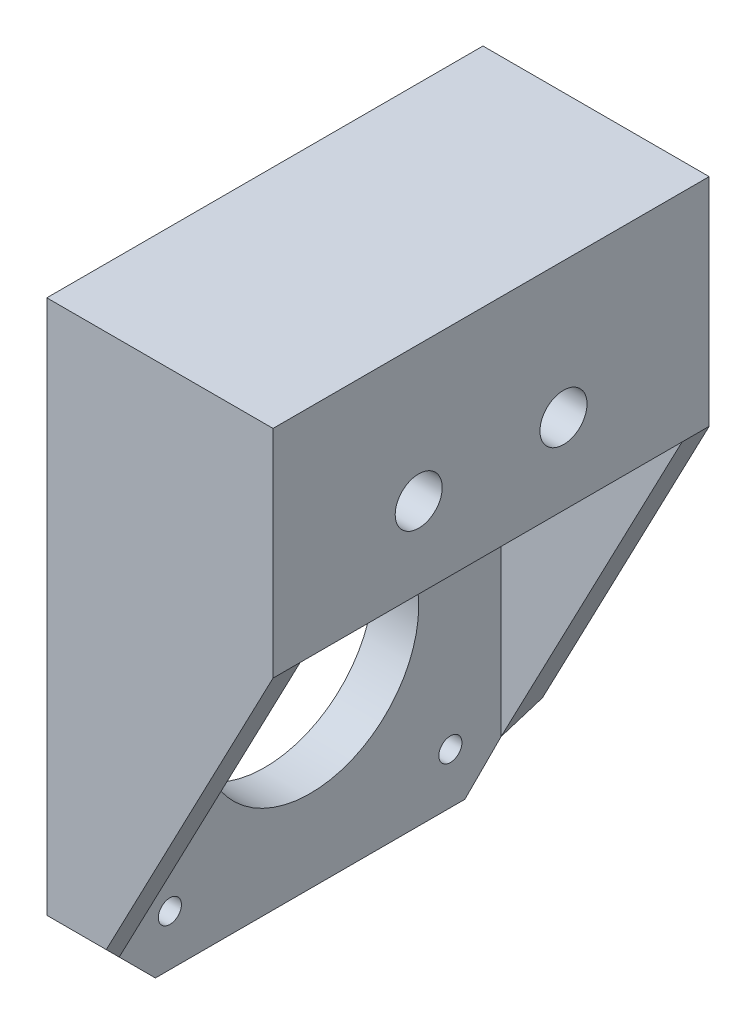
ISO-10303-21;
HEADER;
FILE_DESCRIPTION(('STEP AP214'),'2;1');
FILE_NAME('part.step','',(''),(''),'','','');
FILE_SCHEMA(('AUTOMOTIVE_DESIGN { 1 0 10303 214 1 1 1 1 }'));
ENDSEC;
DATA;
#1=APPLICATION_CONTEXT('core data for automotive mechanical design processes');
#2=APPLICATION_PROTOCOL_DEFINITION('international standard','automotive_design',2000,#1);
#3=PRODUCT_CONTEXT('',#1,'mechanical');
#4=PRODUCT('Part','Part','',(#3));
#5=PRODUCT_RELATED_PRODUCT_CATEGORY('part','',(#4));
#6=PRODUCT_DEFINITION_FORMATION('','',#4);
#7=PRODUCT_DEFINITION_CONTEXT('part definition',#1,'design');
#8=PRODUCT_DEFINITION('design','',#6,#7);
#9=PRODUCT_DEFINITION_SHAPE('','',#8);
#10=(LENGTH_UNIT() NAMED_UNIT(*) SI_UNIT(.MILLI.,.METRE.));
#11=(NAMED_UNIT(*) PLANE_ANGLE_UNIT() SI_UNIT($,.RADIAN.));
#12=(NAMED_UNIT(*) SI_UNIT($,.STERADIAN.) SOLID_ANGLE_UNIT());
#13=UNCERTAINTY_MEASURE_WITH_UNIT(LENGTH_MEASURE(1.E-05),#10,'distance_accuracy_value','');
#14=(GEOMETRIC_REPRESENTATION_CONTEXT(3) GLOBAL_UNCERTAINTY_ASSIGNED_CONTEXT((#13)) GLOBAL_UNIT_ASSIGNED_CONTEXT((#10,
#11,#12)) REPRESENTATION_CONTEXT('',''));
#15=CARTESIAN_POINT('',(0.,0.,0.));
#16=DIRECTION('',(0.,0.,1.));
#17=DIRECTION('',(1.,0.,0.));
#18=AXIS2_PLACEMENT_3D('',#15,#16,#17);
#19=CARTESIAN_POINT('',(20.,0.,0.));
#20=DIRECTION('',(1.,0.,0.));
#21=DIRECTION('',(0.,0.,-1.));
#22=AXIS2_PLACEMENT_3D('',#19,#20,#21);
#23=PLANE('',#22);
#24=CARTESIAN_POINT('',(20.,16.9214351595647,13.4826477279715));
#25=DIRECTION('',(-1.,0.,0.));
#26=DIRECTION('',(0.,0.,1.));
#27=AXIS2_PLACEMENT_3D('',#24,#25,#26);
#28=CIRCLE('',#27,2.59999999999999);
#29=CARTESIAN_POINT('',(20.,16.9214351595647,16.0826477279715));
#30=VERTEX_POINT('',#29);
#31=EDGE_CURVE('E511',#30,#30,#28,.F.);
#32=ORIENTED_EDGE('',*,*,#31,.T.);
#33=EDGE_LOOP('',(#32));
#34=FACE_BOUND('',#33,.T.);
#35=CARTESIAN_POINT('',(20.,16.9214351595647,29.4826477279715));
#36=DIRECTION('',(-1.,0.,0.));
#37=DIRECTION('',(0.,0.,1.));
#38=AXIS2_PLACEMENT_3D('',#35,#36,#37);
#39=CIRCLE('',#38,2.59999999999999);
#40=CARTESIAN_POINT('',(20.,16.9214351595647,32.0826477279715));
#41=VERTEX_POINT('',#40);
#42=EDGE_CURVE('E510',#41,#41,#39,.T.);
#43=ORIENTED_EDGE('',*,*,#42,.F.);
#44=EDGE_LOOP('',(#43));
#45=FACE_BOUND('',#44,.T.);
#46=DIRECTION('',(0.,0.,1.));
#47=VECTOR('',#46,1.);
#48=CARTESIAN_POINT('',(20.,26.9214351595647,0.));
#49=LINE('',#48,#47);
#50=CARTESIAN_POINT('',(20.,26.9214351595647,9.48264772797149));
#51=VERTEX_POINT('',#50);
#52=CARTESIAN_POINT('',(20.,26.9214351595647,33.4826477279715));
#53=VERTEX_POINT('',#52);
#54=EDGE_CURVE('E204',#51,#53,#49,.T.);
#55=ORIENTED_EDGE('',*,*,#54,.F.);
#56=DIRECTION('',(0.,-1.,0.));
#57=VECTOR('',#56,1.);
#58=CARTESIAN_POINT('',(20.,8.02143515956464,9.48264772797147));
#59=LINE('',#58,#57);
#60=CARTESIAN_POINT('',(20.,8.02143515956464,9.48264772797149));
#61=VERTEX_POINT('',#60);
#62=EDGE_CURVE('E231',#51,#61,#59,.T.);
#63=ORIENTED_EDGE('',*,*,#62,.T.);
#64=DIRECTION('',(0.,0.,-1.));
#65=VECTOR('',#64,1.);
#66=CARTESIAN_POINT('',(20.,8.02143515956464,45.5826477279715));
#67=LINE('',#66,#65);
#68=CARTESIAN_POINT('',(20.,8.02143515956464,33.4826477279715));
#69=VERTEX_POINT('',#68);
#70=EDGE_CURVE('E375',#69,#61,#67,.T.);
#71=ORIENTED_EDGE('',*,*,#70,.F.);
#72=DIRECTION('',(0.,1.,0.));
#73=VECTOR('',#72,1.);
#74=CARTESIAN_POINT('',(20.,25.8214351595647,33.4826477279715));
#75=LINE('',#74,#73);
#76=EDGE_CURVE('E235',#69,#53,#75,.T.);
#77=ORIENTED_EDGE('',*,*,#76,.T.);
#78=EDGE_LOOP('',(#55,#63,#71,#77));
#79=FACE_BOUND('',#78,.T.);
#80=ADVANCED_FACE('F47',(#34,#45,#79),#23,.F.);
#81=CARTESIAN_POINT('',(5.,0.,6.48264772797147));
#82=DIRECTION('',(0.,0.,-1.));
#83=DIRECTION('',(-1.,0.,0.));
#84=AXIS2_PLACEMENT_3D('',#81,#82,#83);
#85=PLANE('',#84);
#86=DIRECTION('',(1.,0.,0.));
#87=VECTOR('',#86,1.);
#88=CARTESIAN_POINT('',(5.,26.9214351595647,6.48264772797147));
#89=LINE('',#88,#87);
#90=CARTESIAN_POINT('',(0.,26.9214351595647,6.48264772797147));
#91=VERTEX_POINT('',#90);
#92=CARTESIAN_POINT('',(17.,26.9214351595647,6.48264772797147));
#93=VERTEX_POINT('',#92);
#94=EDGE_CURVE('E186',#91,#93,#89,.T.);
#95=ORIENTED_EDGE('',*,*,#94,.F.);
#96=DIRECTION('',(0.,-1.,0.));
#97=VECTOR('',#96,1.);
#98=CARTESIAN_POINT('',(0.,0.,6.48264772797147));
#99=LINE('',#98,#97);
#100=CARTESIAN_POINT('',(0.,11.0214351595646,6.48264772797147));
#101=VERTEX_POINT('',#100);
#102=EDGE_CURVE('E198',#91,#101,#99,.T.);
#103=ORIENTED_EDGE('',*,*,#102,.T.);
#104=DIRECTION('',(-1.,0.,0.));
#105=VECTOR('',#104,1.);
#106=CARTESIAN_POINT('',(5.,11.0214351595646,6.48264772797147));
#107=LINE('',#106,#105);
#108=CARTESIAN_POINT('',(5.,11.0214351595646,6.48264772797147));
#109=VERTEX_POINT('',#108);
#110=EDGE_CURVE('E265',#101,#109,#107,.F.);
#111=ORIENTED_EDGE('',*,*,#110,.T.);
#112=DIRECTION('',(0.,-1.,0.));
#113=VECTOR('',#112,1.);
#114=CARTESIAN_POINT('',(5.,0.,6.48264772797147));
#115=LINE('',#114,#113);
#116=CARTESIAN_POINT('',(5.,8.02143515956464,6.48264772797147));
#117=VERTEX_POINT('',#116);
#118=EDGE_CURVE('E70',#109,#117,#115,.T.);
#119=ORIENTED_EDGE('',*,*,#118,.T.);
#120=DIRECTION('',(-1.,0.,0.));
#121=VECTOR('',#120,1.);
#122=CARTESIAN_POINT('',(25.,8.02143515956464,6.48264772797147));
#123=LINE('',#122,#121);
#124=CARTESIAN_POINT('',(17.,8.02143515956464,6.48264772797147));
#125=VERTEX_POINT('',#124);
#126=EDGE_CURVE('E292',#125,#117,#123,.T.);
#127=ORIENTED_EDGE('',*,*,#126,.F.);
#128=DIRECTION('',(0.,-1.,0.));
#129=VECTOR('',#128,1.);
#130=CARTESIAN_POINT('',(17.,25.8214351595647,6.48264772797147));
#131=LINE('',#130,#129);
#132=EDGE_CURVE('E202',#125,#93,#131,.F.);
#133=ORIENTED_EDGE('',*,*,#132,.T.);
#134=EDGE_LOOP('',(#95,#103,#111,#119,#127,#133));
#135=FACE_BOUND('',#134,.T.);
#136=ADVANCED_FACE('F197',(#135),#85,.F.);
#137=CARTESIAN_POINT('',(5.,0.,36.4826477279715));
#138=DIRECTION('',(0.,0.,1.));
#139=DIRECTION('',(-1.,0.,0.));
#140=AXIS2_PLACEMENT_3D('',#137,#138,#139);
#141=PLANE('',#140);
#142=DIRECTION('',(-1.,0.,0.));
#143=VECTOR('',#142,1.);
#144=CARTESIAN_POINT('',(5.,26.9214351595647,36.4826477279715));
#145=LINE('',#144,#143);
#146=CARTESIAN_POINT('',(17.,26.9214351595647,36.4826477279715));
#147=VERTEX_POINT('',#146);
#148=CARTESIAN_POINT('',(0.,26.9214351595647,36.4826477279715));
#149=VERTEX_POINT('',#148);
#150=EDGE_CURVE('E189',#147,#149,#145,.T.);
#151=ORIENTED_EDGE('',*,*,#150,.F.);
#152=DIRECTION('',(0.,1.,0.));
#153=VECTOR('',#152,1.);
#154=CARTESIAN_POINT('',(17.,8.02143515956464,36.4826477279715));
#155=LINE('',#154,#153);
#156=CARTESIAN_POINT('',(17.,8.02143515956464,36.4826477279715));
#157=VERTEX_POINT('',#156);
#158=EDGE_CURVE('E239',#147,#157,#155,.F.);
#159=ORIENTED_EDGE('',*,*,#158,.T.);
#160=DIRECTION('',(-1.,0.,0.));
#161=VECTOR('',#160,1.);
#162=CARTESIAN_POINT('',(25.,8.02143515956464,36.4826477279715));
#163=LINE('',#162,#161);
#164=CARTESIAN_POINT('',(5.,8.02143515956464,36.4826477279715));
#165=VERTEX_POINT('',#164);
#166=EDGE_CURVE('E417',#157,#165,#163,.T.);
#167=ORIENTED_EDGE('',*,*,#166,.T.);
#168=DIRECTION('',(0.,1.,0.));
#169=VECTOR('',#168,1.);
#170=CARTESIAN_POINT('',(5.,0.,36.4826477279715));
#171=LINE('',#170,#169);
#172=CARTESIAN_POINT('',(5.,11.0214351595646,36.4826477279715));
#173=VERTEX_POINT('',#172);
#174=EDGE_CURVE('E63',#165,#173,#171,.T.);
#175=ORIENTED_EDGE('',*,*,#174,.T.);
#176=DIRECTION('',(-1.,0.,0.));
#177=VECTOR('',#176,1.);
#178=CARTESIAN_POINT('',(0.,11.0214351595646,36.4826477279715));
#179=LINE('',#178,#177);
#180=CARTESIAN_POINT('',(0.,11.0214351595646,36.4826477279715));
#181=VERTEX_POINT('',#180);
#182=EDGE_CURVE('E252',#173,#181,#179,.T.);
#183=ORIENTED_EDGE('',*,*,#182,.T.);
#184=DIRECTION('',(0.,-1.,0.));
#185=VECTOR('',#184,1.);
#186=CARTESIAN_POINT('',(0.,0.,36.4826477279715));
#187=LINE('',#186,#185);
#188=EDGE_CURVE('E428',#149,#181,#187,.T.);
#189=ORIENTED_EDGE('',*,*,#188,.F.);
#190=EDGE_LOOP('',(#151,#159,#167,#175,#183,#189));
#191=FACE_BOUND('',#190,.T.);
#192=ADVANCED_FACE('F559',(#191),#141,.F.);
#193=CARTESIAN_POINT('',(17.,0.,33.4826477279715));
#194=DIRECTION('',(0.,-1.,0.));
#195=DIRECTION('',(0.,0.,-1.));
#196=AXIS2_PLACEMENT_3D('',#193,#194,#195);
#197=CYLINDRICAL_SURFACE('',#196,3.);
#198=CARTESIAN_POINT('',(17.,26.9214351595647,33.4826477279715));
#199=DIRECTION('',(0.,1.,0.));
#200=DIRECTION('',(0.,0.,1.));
#201=AXIS2_PLACEMENT_3D('',#198,#199,#200);
#202=CIRCLE('',#201,3.);
#203=EDGE_CURVE('E497',#53,#147,#202,.F.);
#204=ORIENTED_EDGE('',*,*,#203,.F.);
#205=ORIENTED_EDGE('',*,*,#76,.F.);
#206=CARTESIAN_POINT('',(17.,8.02143515956464,33.4826477279715));
#207=DIRECTION('',(0.,-1.,0.));
#208=DIRECTION('',(0.,0.,-1.));
#209=AXIS2_PLACEMENT_3D('',#206,#207,#208);
#210=CIRCLE('',#209,3.);
#211=EDGE_CURVE('E244',#157,#69,#210,.F.);
#212=ORIENTED_EDGE('',*,*,#211,.F.);
#213=ORIENTED_EDGE('',*,*,#158,.F.);
#214=EDGE_LOOP('',(#204,#205,#212,#213));
#215=FACE_BOUND('',#214,.T.);
#216=ADVANCED_FACE('F496',(#215),#197,.F.);
#217=CARTESIAN_POINT('',(17.,0.,9.48264772797147));
#218=DIRECTION('',(0.,1.,0.));
#219=DIRECTION('',(0.,0.,1.));
#220=AXIS2_PLACEMENT_3D('',#217,#218,#219);
#221=CYLINDRICAL_SURFACE('',#220,3.);
#222=CARTESIAN_POINT('',(17.,26.9214351595647,9.48264772797147));
#223=DIRECTION('',(0.,1.,0.));
#224=DIRECTION('',(0.,0.,1.));
#225=AXIS2_PLACEMENT_3D('',#222,#223,#224);
#226=CIRCLE('',#225,3.);
#227=EDGE_CURVE('E11',#93,#51,#226,.F.);
#228=ORIENTED_EDGE('',*,*,#227,.F.);
#229=ORIENTED_EDGE('',*,*,#132,.F.);
#230=CARTESIAN_POINT('',(17.,8.02143515956464,9.48264772797147));
#231=DIRECTION('',(0.,-1.,0.));
#232=DIRECTION('',(0.,0.,-1.));
#233=AXIS2_PLACEMENT_3D('',#230,#231,#232);
#234=CIRCLE('',#233,3.);
#235=EDGE_CURVE('E247',#61,#125,#234,.F.);
#236=ORIENTED_EDGE('',*,*,#235,.F.);
#237=ORIENTED_EDGE('',*,*,#62,.F.);
#238=EDGE_LOOP('',(#228,#229,#236,#237));
#239=FACE_BOUND('',#238,.T.);
#240=ADVANCED_FACE('F502',(#239),#221,.F.);
#241=CARTESIAN_POINT('',(25.,0.,0.));
#242=DIRECTION('',(1.,0.,0.));
#243=DIRECTION('',(0.,0.,-1.));
#244=AXIS2_PLACEMENT_3D('',#241,#242,#243);
#245=PLANE('',#244);
#246=DIRECTION('',(0.,0.,-1.));
#247=VECTOR('',#246,1.);
#248=CARTESIAN_POINT('',(25.,31.9214351595647,45.5826477279715));
#249=LINE('',#248,#247);
#250=CARTESIAN_POINT('',(25.,31.9214351595647,45.5826477279715));
#251=VERTEX_POINT('',#250);
#252=CARTESIAN_POINT('',(25.,31.9214351595647,-2.61735227202852));
#253=VERTEX_POINT('',#252);
#254=EDGE_CURVE('E377',#251,#253,#249,.T.);
#255=ORIENTED_EDGE('',*,*,#254,.F.);
#256=DIRECTION('',(0.,1.,0.));
#257=VECTOR('',#256,1.);
#258=CARTESIAN_POINT('',(25.,25.8214351595647,45.5826477279715));
#259=LINE('',#258,#257);
#260=CARTESIAN_POINT('',(25.,8.02143515956464,45.5826477279715));
#261=VERTEX_POINT('',#260);
#262=EDGE_CURVE('E414',#261,#251,#259,.T.);
#263=ORIENTED_EDGE('',*,*,#262,.F.);
#264=DIRECTION('',(0.,0.,-1.));
#265=VECTOR('',#264,1.);
#266=CARTESIAN_POINT('',(25.,8.02143515956464,45.5826477279715));
#267=LINE('',#266,#265);
#268=CARTESIAN_POINT('',(25.,8.02143515956464,42.5826477279715));
#269=VERTEX_POINT('',#268);
#270=EDGE_CURVE('E403',#261,#269,#267,.T.);
#271=ORIENTED_EDGE('',*,*,#270,.T.);
#272=DIRECTION('',(0.,0.,-1.));
#273=VECTOR('',#272,1.);
#274=CARTESIAN_POINT('',(25.,8.02143515956464,6.48264772797147));
#275=LINE('',#274,#273);
#276=CARTESIAN_POINT('',(25.,8.02143515956464,0.382647727971478));
#277=VERTEX_POINT('',#276);
#278=EDGE_CURVE('E308',#269,#277,#275,.T.);
#279=ORIENTED_EDGE('',*,*,#278,.T.);
#280=DIRECTION('',(0.,0.,1.));
#281=VECTOR('',#280,1.);
#282=CARTESIAN_POINT('',(25.,8.02143515956464,-2.61735227202852));
#283=LINE('',#282,#281);
#284=CARTESIAN_POINT('',(25.,8.02143515956464,-2.61735227202852));
#285=VERTEX_POINT('',#284);
#286=EDGE_CURVE('E309',#285,#277,#283,.T.);
#287=ORIENTED_EDGE('',*,*,#286,.F.);
#288=DIRECTION('',(0.,1.,0.));
#289=VECTOR('',#288,1.);
#290=CARTESIAN_POINT('',(25.,25.8214351595647,-2.61735227202852));
#291=LINE('',#290,#289);
#292=EDGE_CURVE('E303',#285,#253,#291,.T.);
#293=ORIENTED_EDGE('',*,*,#292,.T.);
#294=EDGE_LOOP('',(#255,#263,#271,#279,#287,#293));
#295=FACE_BOUND('',#294,.T.);
#296=CARTESIAN_POINT('',(25.,16.9214351595647,29.4826477279715));
#297=DIRECTION('',(1.,0.,0.));
#298=DIRECTION('',(0.,0.,-1.));
#299=AXIS2_PLACEMENT_3D('',#296,#297,#298);
#300=CIRCLE('',#299,2.59999999999999);
#301=CARTESIAN_POINT('',(25.,16.9214351595647,26.8826477279715));
#302=VERTEX_POINT('',#301);
#303=EDGE_CURVE('E515',#302,#302,#300,.T.);
#304=ORIENTED_EDGE('',*,*,#303,.F.);
#305=EDGE_LOOP('',(#304));
#306=FACE_BOUND('',#305,.T.);
#307=CARTESIAN_POINT('',(25.,16.9214351595647,13.4826477279715));
#308=DIRECTION('',(1.,0.,0.));
#309=DIRECTION('',(0.,0.,-1.));
#310=AXIS2_PLACEMENT_3D('',#307,#308,#309);
#311=CIRCLE('',#310,2.59999999999999);
#312=CARTESIAN_POINT('',(25.,16.9214351595647,10.8826477279715));
#313=VERTEX_POINT('',#312);
#314=EDGE_CURVE('E522',#313,#313,#311,.F.);
#315=ORIENTED_EDGE('',*,*,#314,.T.);
#316=EDGE_LOOP('',(#315));
#317=FACE_BOUND('',#316,.T.);
#318=ADVANCED_FACE('F475',(#295,#306,#317),#245,.T.);
#319=CARTESIAN_POINT('',(5.,-14.8984585562319,-14.8984585562319));
#320=DIRECTION('',(0.,0.707106781186548,0.707106781186548));
#321=DIRECTION('',(0.,-0.707106781186548,0.707106781186548));
#322=AXIS2_PLACEMENT_3D('',#319,#320,#321);
#323=PLANE('',#322);
#324=DIRECTION('',(0.,0.707106781186548,-0.707106781186548));
#325=VECTOR('',#324,1.);
#326=CARTESIAN_POINT('',(0.,-14.8984585562319,-14.8984585562319));
#327=LINE('',#326,#325);
#328=CARTESIAN_POINT('',(0.,-34.1785648404354,4.38164772797147));
#329=VERTEX_POINT('',#328);
#330=CARTESIAN_POINT('',(0.,-27.1795648404353,-2.61735227202852));
#331=VERTEX_POINT('',#330);
#332=EDGE_CURVE('E220',#329,#331,#327,.T.);
#333=ORIENTED_EDGE('',*,*,#332,.T.);
#334=DIRECTION('',(1.,0.,0.));
#335=VECTOR('',#334,1.);
#336=CARTESIAN_POINT('',(-10.,-27.1795648404353,-2.61735227202852));
#337=LINE('',#336,#335);
#338=CARTESIAN_POINT('',(6.57063951205467,-27.1795648404353,-2.61735227202852));
#339=VERTEX_POINT('',#338);
#340=EDGE_CURVE('E345',#331,#339,#337,.T.);
#341=ORIENTED_EDGE('',*,*,#340,.T.);
#342=DIRECTION('',(0.347176559415175,0.663124587310955,-0.66312458731095));
#343=VECTOR('',#342,1.);
#344=CARTESIAN_POINT('',(5.69066393805867,-28.8603621855464,-0.936554926917474));
#345=LINE('',#344,#343);
#346=CARTESIAN_POINT('',(5.,-30.1795648404354,0.382647727971478));
#347=VERTEX_POINT('',#346);
#348=EDGE_CURVE('E357',#347,#339,#345,.T.);
#349=ORIENTED_EDGE('',*,*,#348,.F.);
#350=DIRECTION('',(0.,0.707106781186548,-0.707106781186548));
#351=VECTOR('',#350,1.);
#352=CARTESIAN_POINT('',(5.,-14.8984585562319,-14.8984585562319));
#353=LINE('',#352,#351);
#354=CARTESIAN_POINT('',(5.,-34.1785648404354,4.38164772797147));
#355=VERTEX_POINT('',#354);
#356=EDGE_CURVE('E327',#355,#347,#353,.T.);
#357=ORIENTED_EDGE('',*,*,#356,.F.);
#358=DIRECTION('',(-1.,0.,0.));
#359=VECTOR('',#358,1.);
#360=CARTESIAN_POINT('',(5.,-34.1785648404354,4.38164772797147));
#361=LINE('',#360,#359);
#362=EDGE_CURVE('E227',#355,#329,#361,.T.);
#363=ORIENTED_EDGE('',*,*,#362,.T.);
#364=EDGE_LOOP('',(#333,#341,#349,#357,#363));
#365=FACE_BOUND('',#364,.T.);
#366=ADVANCED_FACE('F344',(#365),#323,.F.);
#367=CARTESIAN_POINT('',(5.,8.02143515956464,0.));
#368=DIRECTION('',(0.,-1.,0.));
#369=DIRECTION('',(0.,0.,-1.));
#370=AXIS2_PLACEMENT_3D('',#367,#368,#369);
#371=PLANE('',#370);
#372=ORIENTED_EDGE('',*,*,#166,.F.);
#373=ORIENTED_EDGE('',*,*,#211,.T.);
#374=ORIENTED_EDGE('',*,*,#70,.T.);
#375=ORIENTED_EDGE('',*,*,#235,.T.);
#376=ORIENTED_EDGE('',*,*,#126,.T.);
#377=DIRECTION('',(0.,0.,-1.));
#378=VECTOR('',#377,1.);
#379=CARTESIAN_POINT('',(5.,8.02143515956464,6.48264772797147));
#380=LINE('',#379,#378);
#381=CARTESIAN_POINT('',(5.,8.02143515956464,0.382647727971478));
#382=VERTEX_POINT('',#381);
#383=EDGE_CURVE('E297',#117,#382,#380,.T.);
#384=ORIENTED_EDGE('',*,*,#383,.T.);
#385=DIRECTION('',(1.,0.,0.));
#386=VECTOR('',#385,1.);
#387=CARTESIAN_POINT('',(25.,8.02143515956464,0.382647727971478));
#388=LINE('',#387,#386);
#389=EDGE_CURVE('E461',#382,#277,#388,.T.);
#390=ORIENTED_EDGE('',*,*,#389,.T.);
#391=ORIENTED_EDGE('',*,*,#278,.F.);
#392=DIRECTION('',(1.,0.,0.));
#393=VECTOR('',#392,1.);
#394=CARTESIAN_POINT('',(25.,8.02143515956464,42.5826477279715));
#395=LINE('',#394,#393);
#396=CARTESIAN_POINT('',(5.,8.02143515956464,42.5826477279715));
#397=VERTEX_POINT('',#396);
#398=EDGE_CURVE('E404',#397,#269,#395,.T.);
#399=ORIENTED_EDGE('',*,*,#398,.F.);
#400=DIRECTION('',(0.,0.,1.));
#401=VECTOR('',#400,1.);
#402=CARTESIAN_POINT('',(5.,8.02143515956464,36.4826477279715));
#403=LINE('',#402,#401);
#404=EDGE_CURVE('E413',#165,#397,#403,.T.);
#405=ORIENTED_EDGE('',*,*,#404,.F.);
#406=EDGE_LOOP('',(#372,#373,#374,#375,#376,#384,#390,#391,#399,#405));
#407=FACE_BOUND('',#406,.T.);
#408=ADVANCED_FACE('F296',(#407),#371,.T.);
#409=CARTESIAN_POINT('',(5.,0.,-2.61735227202852));
#410=DIRECTION('',(0.,0.,1.));
#411=DIRECTION('',(0.,-1.,0.));
#412=AXIS2_PLACEMENT_3D('',#409,#410,#411);
#413=PLANE('',#412);
#414=DIRECTION('',(-1.,0.,0.));
#415=VECTOR('',#414,1.);
#416=CARTESIAN_POINT('',(25.,31.9214351595647,-2.61735227202852));
#417=LINE('',#416,#415);
#418=CARTESIAN_POINT('',(0.,31.9214351595647,-2.61735227202852));
#419=VERTEX_POINT('',#418);
#420=EDGE_CURVE('E371',#253,#419,#417,.T.);
#421=ORIENTED_EDGE('',*,*,#420,.F.);
#422=ORIENTED_EDGE('',*,*,#292,.F.);
#423=DIRECTION('',(-0.46382413738778,-0.88592729361753,0.));
#424=VECTOR('',#423,1.);
#425=CARTESIAN_POINT('',(5.,-30.1795648404354,-2.61735227202852));
#426=LINE('',#425,#424);
#427=EDGE_CURVE('E316',#285,#339,#426,.T.);
#428=ORIENTED_EDGE('',*,*,#427,.T.);
#429=ORIENTED_EDGE('',*,*,#340,.F.);
#430=DIRECTION('',(0.,1.,0.));
#431=VECTOR('',#430,1.);
#432=CARTESIAN_POINT('',(0.,0.,-2.61735227202852));
#433=LINE('',#432,#431);
#434=EDGE_CURVE('E213',#331,#419,#433,.T.);
#435=ORIENTED_EDGE('',*,*,#434,.T.);
#436=EDGE_LOOP('',(#421,#422,#428,#429,#435));
#437=FACE_BOUND('',#436,.T.);
#438=ADVANCED_FACE('F353',(#437),#413,.F.);
#439=CARTESIAN_POINT('',(5.,8.02143515956464,0.));
#440=DIRECTION('',(0.,-1.,0.));
#441=DIRECTION('',(0.,0.,-1.));
#442=AXIS2_PLACEMENT_3D('',#439,#440,#441);
#443=PLANE('',#442);
#444=DIRECTION('',(0.,0.,1.));
#445=VECTOR('',#444,1.);
#446=CARTESIAN_POINT('',(0.,8.02143515956464,0.));
#447=LINE('',#446,#445);
#448=CARTESIAN_POINT('',(0.,8.02143515956464,9.48264772797147));
#449=VERTEX_POINT('',#448);
#450=CARTESIAN_POINT('',(0.,8.02143515956464,33.4826477279715));
#451=VERTEX_POINT('',#450);
#452=EDGE_CURVE('E212',#449,#451,#447,.T.);
#453=ORIENTED_EDGE('',*,*,#452,.T.);
#454=DIRECTION('',(-1.,0.,0.));
#455=VECTOR('',#454,1.);
#456=CARTESIAN_POINT('',(5.,8.02143515956464,33.4826477279715));
#457=LINE('',#456,#455);
#458=CARTESIAN_POINT('',(5.,8.02143515956464,33.4826477279715));
#459=VERTEX_POINT('',#458);
#460=EDGE_CURVE('E260',#451,#459,#457,.F.);
#461=ORIENTED_EDGE('',*,*,#460,.T.);
#462=DIRECTION('',(0.,0.,1.));
#463=VECTOR('',#462,1.);
#464=CARTESIAN_POINT('',(5.,8.02143515956464,0.));
#465=LINE('',#464,#463);
#466=CARTESIAN_POINT('',(5.,8.02143515956464,9.48264772797147));
#467=VERTEX_POINT('',#466);
#468=EDGE_CURVE('E281',#467,#459,#465,.T.);
#469=ORIENTED_EDGE('',*,*,#468,.F.);
#470=DIRECTION('',(-1.,0.,0.));
#471=VECTOR('',#470,1.);
#472=CARTESIAN_POINT('',(0.,8.02143515956464,9.48264772797147));
#473=LINE('',#472,#471);
#474=EDGE_CURVE('E256',#467,#449,#473,.T.);
#475=ORIENTED_EDGE('',*,*,#474,.T.);
#476=EDGE_LOOP('',(#453,#461,#469,#475));
#477=FACE_BOUND('',#476,.T.);
#478=ADVANCED_FACE('F286',(#477),#443,.F.);
#479=CARTESIAN_POINT('',(5.,-28.5785648404354,5.98264772797147));
#480=DIRECTION('',(-1.,0.,0.));
#481=DIRECTION('',(0.,0.,1.));
#482=AXIS2_PLACEMENT_3D('',#479,#480,#481);
#483=CYLINDRICAL_SURFACE('',#482,1.275);
#484=CARTESIAN_POINT('',(5.,-28.5785648404354,5.98264772797147));
#485=DIRECTION('',(1.,0.,0.));
#486=DIRECTION('',(0.,0.,-1.));
#487=AXIS2_PLACEMENT_3D('',#484,#485,#486);
#488=CIRCLE('',#487,1.275);
#489=CARTESIAN_POINT('',(5.,-28.5785648404354,4.70764772797147));
#490=VERTEX_POINT('',#489);
#491=EDGE_CURVE('E323',#490,#490,#488,.T.);
#492=ORIENTED_EDGE('',*,*,#491,.T.);
#493=EDGE_LOOP('',(#492));
#494=FACE_BOUND('',#493,.T.);
#495=CARTESIAN_POINT('',(0.,-28.5785648404354,5.98264772797147));
#496=DIRECTION('',(1.,0.,0.));
#497=DIRECTION('',(0.,0.,-1.));
#498=AXIS2_PLACEMENT_3D('',#495,#496,#497);
#499=CIRCLE('',#498,1.275);
#500=CARTESIAN_POINT('',(0.,-28.5785648404354,4.70764772797147));
#501=VERTEX_POINT('',#500);
#502=EDGE_CURVE('E337',#501,#501,#499,.T.);
#503=ORIENTED_EDGE('',*,*,#502,.F.);
#504=EDGE_LOOP('',(#503));
#505=FACE_BOUND('',#504,.T.);
#506=ADVANCED_FACE('F547',(#494,#505),#483,.F.);
#507=CARTESIAN_POINT('',(5.,2.42143515956463,5.98264772797147));
#508=DIRECTION('',(-1.,0.,0.));
#509=DIRECTION('',(0.,0.,1.));
#510=AXIS2_PLACEMENT_3D('',#507,#508,#509);
#511=CYLINDRICAL_SURFACE('',#510,1.275);
#512=CARTESIAN_POINT('',(5.,2.42143515956463,5.98264772797147));
#513=DIRECTION('',(1.,0.,0.));
#514=DIRECTION('',(0.,0.,-1.));
#515=AXIS2_PLACEMENT_3D('',#512,#513,#514);
#516=CIRCLE('',#515,1.275);
#517=CARTESIAN_POINT('',(5.,2.42143515956463,4.70764772797147));
#518=VERTEX_POINT('',#517);
#519=EDGE_CURVE('E226',#518,#518,#516,.T.);
#520=ORIENTED_EDGE('',*,*,#519,.T.);
#521=EDGE_LOOP('',(#520));
#522=FACE_BOUND('',#521,.T.);
#523=CARTESIAN_POINT('',(0.,2.42143515956463,5.98264772797147));
#524=DIRECTION('',(1.,0.,0.));
#525=DIRECTION('',(0.,0.,-1.));
#526=AXIS2_PLACEMENT_3D('',#523,#524,#525);
#527=CIRCLE('',#526,1.275);
#528=CARTESIAN_POINT('',(0.,2.42143515956463,4.70764772797147));
#529=VERTEX_POINT('',#528);
#530=EDGE_CURVE('E302',#529,#529,#527,.T.);
#531=ORIENTED_EDGE('',*,*,#530,.F.);
#532=EDGE_LOOP('',(#531));
#533=FACE_BOUND('',#532,.T.);
#534=ADVANCED_FACE('F538',(#522,#533),#511,.F.);
#535=CARTESIAN_POINT('',(5.,-34.1785648404354,0.));
#536=DIRECTION('',(0.,1.,0.));
#537=DIRECTION('',(0.,0.,1.));
#538=AXIS2_PLACEMENT_3D('',#535,#536,#537);
#539=PLANE('',#538);
#540=DIRECTION('',(0.,0.,-1.));
#541=VECTOR('',#540,1.);
#542=CARTESIAN_POINT('',(0.,-34.1785648404354,0.));
#543=LINE('',#542,#541);
#544=CARTESIAN_POINT('',(0.,-34.1785648404354,38.5836477279715));
#545=VERTEX_POINT('',#544);
#546=EDGE_CURVE('E218',#545,#329,#543,.T.);
#547=ORIENTED_EDGE('',*,*,#546,.T.);
#548=ORIENTED_EDGE('',*,*,#362,.F.);
#549=DIRECTION('',(0.,0.,-1.));
#550=VECTOR('',#549,1.);
#551=CARTESIAN_POINT('',(5.,-34.1785648404354,0.));
#552=LINE('',#551,#550);
#553=CARTESIAN_POINT('',(5.,-34.1785648404354,38.5836477279715));
#554=VERTEX_POINT('',#553);
#555=EDGE_CURVE('E232',#554,#355,#552,.T.);
#556=ORIENTED_EDGE('',*,*,#555,.F.);
#557=DIRECTION('',(-1.,0.,0.));
#558=VECTOR('',#557,1.);
#559=CARTESIAN_POINT('',(5.,-34.1785648404354,38.5836477279715));
#560=LINE('',#559,#558);
#561=EDGE_CURVE('E358',#554,#545,#560,.T.);
#562=ORIENTED_EDGE('',*,*,#561,.T.);
#563=EDGE_LOOP('',(#547,#548,#556,#562));
#564=FACE_BOUND('',#563,.T.);
#565=ADVANCED_FACE('F536',(#564),#539,.F.);
#566=CARTESIAN_POINT('',(5.,0.,0.));
#567=DIRECTION('',(1.,0.,0.));
#568=DIRECTION('',(0.,0.,-1.));
#569=AXIS2_PLACEMENT_3D('',#566,#567,#568);
#570=PLANE('',#569);
#571=CARTESIAN_POINT('',(5.,-13.0785648404354,21.4826477279715));
#572=DIRECTION('',(1.,0.,0.));
#573=DIRECTION('',(0.,0.,-1.));
#574=AXIS2_PLACEMENT_3D('',#571,#572,#573);
#575=CIRCLE('',#574,12.);
#576=CARTESIAN_POINT('',(5.,-13.0785648404354,9.48264772797147));
#577=VERTEX_POINT('',#576);
#578=EDGE_CURVE('E383',#577,#577,#575,.T.);
#579=ORIENTED_EDGE('',*,*,#578,.F.);
#580=EDGE_LOOP('',(#579));
#581=FACE_BOUND('',#580,.T.);
#582=ORIENTED_EDGE('',*,*,#383,.F.);
#583=ORIENTED_EDGE('',*,*,#118,.F.);
#584=CARTESIAN_POINT('',(5.,11.0214351595646,9.48264772797147));
#585=DIRECTION('',(1.,0.,0.));
#586=DIRECTION('',(0.,0.,-1.));
#587=AXIS2_PLACEMENT_3D('',#584,#585,#586);
#588=CIRCLE('',#587,3.);
#589=EDGE_CURVE('E56',#109,#467,#588,.F.);
#590=ORIENTED_EDGE('',*,*,#589,.T.);
#591=ORIENTED_EDGE('',*,*,#468,.T.);
#592=CARTESIAN_POINT('',(5.,11.0214351595646,33.4826477279715));
#593=DIRECTION('',(1.,0.,0.));
#594=DIRECTION('',(0.,0.,-1.));
#595=AXIS2_PLACEMENT_3D('',#592,#593,#594);
#596=CIRCLE('',#595,3.);
#597=EDGE_CURVE('E271',#459,#173,#596,.F.);
#598=ORIENTED_EDGE('',*,*,#597,.T.);
#599=ORIENTED_EDGE('',*,*,#174,.F.);
#600=ORIENTED_EDGE('',*,*,#404,.T.);
#601=DIRECTION('',(0.,1.,0.));
#602=VECTOR('',#601,1.);
#603=CARTESIAN_POINT('',(5.,0.,42.5826477279715));
#604=LINE('',#603,#602);
#605=CARTESIAN_POINT('',(5.,-30.1795648404354,42.5826477279715));
#606=VERTEX_POINT('',#605);
#607=EDGE_CURVE('E436',#606,#397,#604,.T.);
#608=ORIENTED_EDGE('',*,*,#607,.F.);
#609=DIRECTION('',(0.,0.707106781186548,0.707106781186548));
#610=VECTOR('',#609,1.);
#611=CARTESIAN_POINT('',(5.,-14.8984585562319,57.8637540121749));
#612=LINE('',#611,#610);
#613=EDGE_CURVE('E432',#554,#606,#612,.T.);
#614=ORIENTED_EDGE('',*,*,#613,.F.);
#615=ORIENTED_EDGE('',*,*,#555,.T.);
#616=ORIENTED_EDGE('',*,*,#356,.T.);
#617=DIRECTION('',(0.,1.,0.));
#618=VECTOR('',#617,1.);
#619=CARTESIAN_POINT('',(5.,0.,0.382647727971478));
#620=LINE('',#619,#618);
#621=EDGE_CURVE('E289',#347,#382,#620,.T.);
#622=ORIENTED_EDGE('',*,*,#621,.T.);
#623=EDGE_LOOP('',(#582,#583,#590,#591,#598,#599,#600,#608,#614,#615,#616,#622));
#624=FACE_BOUND('',#623,.T.);
#625=ORIENTED_EDGE('',*,*,#519,.F.);
#626=EDGE_LOOP('',(#625));
#627=FACE_BOUND('',#626,.T.);
#628=ORIENTED_EDGE('',*,*,#491,.F.);
#629=EDGE_LOOP('',(#628));
#630=FACE_BOUND('',#629,.T.);
#631=CARTESIAN_POINT('',(5.,2.42143515956463,36.9826477279715));
#632=DIRECTION('',(-1.,0.,0.));
#633=DIRECTION('',(0.,0.,1.));
#634=AXIS2_PLACEMENT_3D('',#631,#632,#633);
#635=CIRCLE('',#634,1.275);
#636=CARTESIAN_POINT('',(5.,2.42143515956463,38.2576477279715));
#637=VERTEX_POINT('',#636);
#638=EDGE_CURVE('E423',#637,#637,#635,.T.);
#639=ORIENTED_EDGE('',*,*,#638,.T.);
#640=EDGE_LOOP('',(#639));
#641=FACE_BOUND('',#640,.T.);
#642=CARTESIAN_POINT('',(5.,-28.5785648404354,36.9826477279715));
#643=DIRECTION('',(-1.,0.,0.));
#644=DIRECTION('',(0.,0.,1.));
#645=AXIS2_PLACEMENT_3D('',#642,#643,#644);
#646=CIRCLE('',#645,1.275);
#647=CARTESIAN_POINT('',(5.,-28.5785648404354,38.2576477279715));
#648=VERTEX_POINT('',#647);
#649=EDGE_CURVE('E427',#648,#648,#646,.T.);
#650=ORIENTED_EDGE('',*,*,#649,.T.);
#651=EDGE_LOOP('',(#650));
#652=FACE_BOUND('',#651,.T.);
#653=ADVANCED_FACE('F279',(#581,#624,#627,#630,#641,#652),#570,.T.);
#654=CARTESIAN_POINT('',(0.,0.,0.));
#655=DIRECTION('',(1.,0.,0.));
#656=DIRECTION('',(0.,0.,-1.));
#657=AXIS2_PLACEMENT_3D('',#654,#655,#656);
#658=PLANE('',#657);
#659=ORIENTED_EDGE('',*,*,#102,.F.);
#660=DIRECTION('',(0.,0.,1.));
#661=VECTOR('',#660,1.);
#662=CARTESIAN_POINT('',(0.,26.9214351595647,-2.61735227202852));
#663=LINE('',#662,#661);
#664=EDGE_CURVE('E183',#91,#149,#663,.T.);
#665=ORIENTED_EDGE('',*,*,#664,.T.);
#666=ORIENTED_EDGE('',*,*,#188,.T.);
#667=CARTESIAN_POINT('',(0.,11.0214351595646,33.4826477279715));
#668=DIRECTION('',(1.,0.,0.));
#669=DIRECTION('',(0.,0.,-1.));
#670=AXIS2_PLACEMENT_3D('',#667,#668,#669);
#671=CIRCLE('',#670,3.);
#672=EDGE_CURVE('E268',#181,#451,#671,.T.);
#673=ORIENTED_EDGE('',*,*,#672,.T.);
#674=ORIENTED_EDGE('',*,*,#452,.F.);
#675=CARTESIAN_POINT('',(0.,11.0214351595646,9.48264772797147));
#676=DIRECTION('',(1.,0.,0.));
#677=DIRECTION('',(0.,0.,-1.));
#678=AXIS2_PLACEMENT_3D('',#675,#676,#677);
#679=CIRCLE('',#678,3.);
#680=EDGE_CURVE('E209',#449,#101,#679,.T.);
#681=ORIENTED_EDGE('',*,*,#680,.T.);
#682=EDGE_LOOP('',(#659,#665,#666,#673,#674,#681));
#683=FACE_BOUND('',#682,.T.);
#684=DIRECTION('',(0.,1.,0.));
#685=VECTOR('',#684,1.);
#686=CARTESIAN_POINT('',(0.,0.,45.5826477279715));
#687=LINE('',#686,#685);
#688=CARTESIAN_POINT('',(0.,-27.1795648404353,45.5826477279715));
#689=VERTEX_POINT('',#688);
#690=CARTESIAN_POINT('',(0.,31.9214351595647,45.5826477279715));
#691=VERTEX_POINT('',#690);
#692=EDGE_CURVE('E365',#689,#691,#687,.T.);
#693=ORIENTED_EDGE('',*,*,#692,.T.);
#694=DIRECTION('',(0.,0.,1.));
#695=VECTOR('',#694,1.);
#696=CARTESIAN_POINT('',(0.,31.9214351595647,-2.61735227202852));
#697=LINE('',#696,#695);
#698=EDGE_CURVE('E363',#419,#691,#697,.T.);
#699=ORIENTED_EDGE('',*,*,#698,.F.);
#700=ORIENTED_EDGE('',*,*,#434,.F.);
#701=ORIENTED_EDGE('',*,*,#332,.F.);
#702=ORIENTED_EDGE('',*,*,#546,.F.);
#703=DIRECTION('',(0.,0.707106781186548,0.707106781186548));
#704=VECTOR('',#703,1.);
#705=CARTESIAN_POINT('',(0.,-14.8984585562319,57.8637540121749));
#706=LINE('',#705,#704);
#707=EDGE_CURVE('E446',#545,#689,#706,.T.);
#708=ORIENTED_EDGE('',*,*,#707,.T.);
#709=EDGE_LOOP('',(#693,#699,#700,#701,#702,#708));
#710=FACE_BOUND('',#709,.T.);
#711=CARTESIAN_POINT('',(0.,-13.0785648404354,21.4826477279715));
#712=DIRECTION('',(1.,0.,0.));
#713=DIRECTION('',(0.,0.,-1.));
#714=AXIS2_PLACEMENT_3D('',#711,#712,#713);
#715=CIRCLE('',#714,12.);
#716=CARTESIAN_POINT('',(0.,-13.0785648404354,9.48264772797147));
#717=VERTEX_POINT('',#716);
#718=EDGE_CURVE('E384',#717,#717,#715,.T.);
#719=ORIENTED_EDGE('',*,*,#718,.T.);
#720=EDGE_LOOP('',(#719));
#721=FACE_BOUND('',#720,.T.);
#722=ORIENTED_EDGE('',*,*,#530,.T.);
#723=EDGE_LOOP('',(#722));
#724=FACE_BOUND('',#723,.T.);
#725=ORIENTED_EDGE('',*,*,#502,.T.);
#726=EDGE_LOOP('',(#725));
#727=FACE_BOUND('',#726,.T.);
#728=CARTESIAN_POINT('',(0.,2.42143515956463,36.9826477279715));
#729=DIRECTION('',(-1.,0.,0.));
#730=DIRECTION('',(0.,0.,1.));
#731=AXIS2_PLACEMENT_3D('',#728,#729,#730);
#732=CIRCLE('',#731,1.275);
#733=CARTESIAN_POINT('',(0.,2.42143515956463,38.2576477279715));
#734=VERTEX_POINT('',#733);
#735=EDGE_CURVE('E422',#734,#734,#732,.T.);
#736=ORIENTED_EDGE('',*,*,#735,.F.);
#737=EDGE_LOOP('',(#736));
#738=FACE_BOUND('',#737,.T.);
#739=CARTESIAN_POINT('',(0.,-28.5785648404354,36.9826477279715));
#740=DIRECTION('',(-1.,0.,0.));
#741=DIRECTION('',(0.,0.,1.));
#742=AXIS2_PLACEMENT_3D('',#739,#740,#741);
#743=CIRCLE('',#742,1.275);
#744=CARTESIAN_POINT('',(0.,-28.5785648404354,38.2576477279715));
#745=VERTEX_POINT('',#744);
#746=EDGE_CURVE('E442',#745,#745,#743,.T.);
#747=ORIENTED_EDGE('',*,*,#746,.F.);
#748=EDGE_LOOP('',(#747));
#749=FACE_BOUND('',#748,.T.);
#750=ADVANCED_FACE('F206',(#683,#710,#721,#724,#727,#738,#749),#658,.F.);
#751=CARTESIAN_POINT('',(5.,-30.1795648404354,-2.61735227202852));
#752=DIRECTION('',(-0.88592729361753,0.46382413738778,0.));
#753=DIRECTION('',(-0.463824137387781,-0.88592729361753,0.));
#754=AXIS2_PLACEMENT_3D('',#751,#752,#753);
#755=PLANE('',#754);
#756=DIRECTION('',(-0.46382413738778,-0.88592729361753,0.));
#757=VECTOR('',#756,1.);
#758=CARTESIAN_POINT('',(5.,-30.1795648404354,0.382647727971478));
#759=LINE('',#758,#757);
#760=EDGE_CURVE('E458',#277,#347,#759,.T.);
#761=ORIENTED_EDGE('',*,*,#760,.T.);
#762=ORIENTED_EDGE('',*,*,#348,.T.);
#763=ORIENTED_EDGE('',*,*,#427,.F.);
#764=ORIENTED_EDGE('',*,*,#286,.T.);
#765=EDGE_LOOP('',(#761,#762,#763,#764));
#766=FACE_BOUND('',#765,.T.);
#767=ADVANCED_FACE('F471',(#766),#755,.F.);
#768=CARTESIAN_POINT('',(0.,0.,0.382647727971478));
#769=DIRECTION('',(0.,0.,1.));
#770=DIRECTION('',(1.,0.,0.));
#771=AXIS2_PLACEMENT_3D('',#768,#769,#770);
#772=PLANE('',#771);
#773=ORIENTED_EDGE('',*,*,#389,.F.);
#774=ORIENTED_EDGE('',*,*,#621,.F.);
#775=ORIENTED_EDGE('',*,*,#760,.F.);
#776=EDGE_LOOP('',(#773,#774,#775));
#777=FACE_BOUND('',#776,.T.);
#778=ADVANCED_FACE('F473',(#777),#772,.T.);
#779=CARTESIAN_POINT('',(5.,-14.8984585562319,57.8637540121749));
#780=DIRECTION('',(0.,0.707106781186548,-0.707106781186548));
#781=DIRECTION('',(0.,-0.707106781186548,-0.707106781186548));
#782=AXIS2_PLACEMENT_3D('',#779,#780,#781);
#783=PLANE('',#782);
#784=ORIENTED_EDGE('',*,*,#707,.F.);
#785=ORIENTED_EDGE('',*,*,#561,.F.);
#786=ORIENTED_EDGE('',*,*,#613,.T.);
#787=DIRECTION('',(0.347176559415175,0.663124587310955,0.66312458731095));
#788=VECTOR('',#787,1.);
#789=CARTESIAN_POINT('',(5.69066393805867,-28.8603621855464,43.9018503828604));
#790=LINE('',#789,#788);
#791=CARTESIAN_POINT('',(6.57063951205467,-27.1795648404353,45.5826477279715));
#792=VERTEX_POINT('',#791);
#793=EDGE_CURVE('E395',#606,#792,#790,.T.);
#794=ORIENTED_EDGE('',*,*,#793,.T.);
#795=DIRECTION('',(1.,0.,0.));
#796=VECTOR('',#795,1.);
#797=CARTESIAN_POINT('',(-10.,-27.1795648404353,45.5826477279715));
#798=LINE('',#797,#796);
#799=EDGE_CURVE('E388',#689,#792,#798,.T.);
#800=ORIENTED_EDGE('',*,*,#799,.F.);
#801=EDGE_LOOP('',(#784,#785,#786,#794,#800));
#802=FACE_BOUND('',#801,.T.);
#803=ADVANCED_FACE('F534',(#802),#783,.F.);
#804=CARTESIAN_POINT('',(5.,0.,45.5826477279715));
#805=DIRECTION('',(0.,0.,-1.));
#806=DIRECTION('',(0.,-1.,0.));
#807=AXIS2_PLACEMENT_3D('',#804,#805,#806);
#808=PLANE('',#807);
#809=DIRECTION('',(1.,0.,0.));
#810=VECTOR('',#809,1.);
#811=CARTESIAN_POINT('',(0.,31.9214351595647,45.5826477279715));
#812=LINE('',#811,#810);
#813=EDGE_CURVE('E370',#691,#251,#812,.T.);
#814=ORIENTED_EDGE('',*,*,#813,.F.);
#815=ORIENTED_EDGE('',*,*,#692,.F.);
#816=ORIENTED_EDGE('',*,*,#799,.T.);
#817=DIRECTION('',(-0.46382413738778,-0.88592729361753,0.));
#818=VECTOR('',#817,1.);
#819=CARTESIAN_POINT('',(5.,-30.1795648404354,45.5826477279715));
#820=LINE('',#819,#818);
#821=EDGE_CURVE('E400',#261,#792,#820,.T.);
#822=ORIENTED_EDGE('',*,*,#821,.F.);
#823=ORIENTED_EDGE('',*,*,#262,.T.);
#824=EDGE_LOOP('',(#814,#815,#816,#822,#823));
#825=FACE_BOUND('',#824,.T.);
#826=ADVANCED_FACE('F530',(#825),#808,.F.);
#827=CARTESIAN_POINT('',(5.,-28.5785648404354,36.9826477279715));
#828=DIRECTION('',(-1.,0.,0.));
#829=DIRECTION('',(0.,0.,-1.));
#830=AXIS2_PLACEMENT_3D('',#827,#828,#829);
#831=CYLINDRICAL_SURFACE('',#830,1.275);
#832=ORIENTED_EDGE('',*,*,#649,.F.);
#833=EDGE_LOOP('',(#832));
#834=FACE_BOUND('',#833,.T.);
#835=ORIENTED_EDGE('',*,*,#746,.T.);
#836=EDGE_LOOP('',(#835));
#837=FACE_BOUND('',#836,.T.);
#838=ADVANCED_FACE('F578',(#834,#837),#831,.F.);
#839=CARTESIAN_POINT('',(5.,2.42143515956463,36.9826477279715));
#840=DIRECTION('',(-1.,0.,0.));
#841=DIRECTION('',(0.,0.,-1.));
#842=AXIS2_PLACEMENT_3D('',#839,#840,#841);
#843=CYLINDRICAL_SURFACE('',#842,1.275);
#844=ORIENTED_EDGE('',*,*,#638,.F.);
#845=EDGE_LOOP('',(#844));
#846=FACE_BOUND('',#845,.T.);
#847=ORIENTED_EDGE('',*,*,#735,.T.);
#848=EDGE_LOOP('',(#847));
#849=FACE_BOUND('',#848,.T.);
#850=ADVANCED_FACE('F573',(#846,#849),#843,.F.);
#851=CARTESIAN_POINT('',(5.,-30.1795648404354,45.5826477279715));
#852=DIRECTION('',(-0.88592729361753,0.46382413738778,0.));
#853=DIRECTION('',(-0.463824137387781,-0.88592729361753,0.));
#854=AXIS2_PLACEMENT_3D('',#851,#852,#853);
#855=PLANE('',#854);
#856=DIRECTION('',(-0.46382413738778,-0.88592729361753,0.));
#857=VECTOR('',#856,1.);
#858=CARTESIAN_POINT('',(5.,-30.1795648404354,42.5826477279715));
#859=LINE('',#858,#857);
#860=EDGE_CURVE('E399',#269,#606,#859,.T.);
#861=ORIENTED_EDGE('',*,*,#860,.F.);
#862=ORIENTED_EDGE('',*,*,#270,.F.);
#863=ORIENTED_EDGE('',*,*,#821,.T.);
#864=ORIENTED_EDGE('',*,*,#793,.F.);
#865=EDGE_LOOP('',(#861,#862,#863,#864));
#866=FACE_BOUND('',#865,.T.);
#867=ADVANCED_FACE('F481',(#866),#855,.F.);
#868=CARTESIAN_POINT('',(0.,0.,42.5826477279715));
#869=DIRECTION('',(0.,0.,-1.));
#870=DIRECTION('',(1.,0.,0.));
#871=AXIS2_PLACEMENT_3D('',#868,#869,#870);
#872=PLANE('',#871);
#873=ORIENTED_EDGE('',*,*,#398,.T.);
#874=ORIENTED_EDGE('',*,*,#860,.T.);
#875=ORIENTED_EDGE('',*,*,#607,.T.);
#876=EDGE_LOOP('',(#873,#874,#875));
#877=FACE_BOUND('',#876,.T.);
#878=ADVANCED_FACE('F485',(#877),#872,.T.);
#879=CARTESIAN_POINT('',(0.,-13.0785648404354,21.4826477279715));
#880=DIRECTION('',(1.,0.,0.));
#881=DIRECTION('',(0.,0.,-1.));
#882=AXIS2_PLACEMENT_3D('',#879,#880,#881);
#883=CYLINDRICAL_SURFACE('',#882,12.);
#884=ORIENTED_EDGE('',*,*,#718,.F.);
#885=EDGE_LOOP('',(#884));
#886=FACE_BOUND('',#885,.T.);
#887=ORIENTED_EDGE('',*,*,#578,.T.);
#888=EDGE_LOOP('',(#887));
#889=FACE_BOUND('',#888,.T.);
#890=ADVANCED_FACE('F565',(#886,#889),#883,.F.);
#891=CARTESIAN_POINT('',(17.,31.9214351595647,9.48264772797147));
#892=DIRECTION('',(0.,1.,0.));
#893=DIRECTION('',(0.,0.,1.));
#894=AXIS2_PLACEMENT_3D('',#891,#892,#893);
#895=PLANE('',#894);
#896=ORIENTED_EDGE('',*,*,#698,.T.);
#897=ORIENTED_EDGE('',*,*,#813,.T.);
#898=ORIENTED_EDGE('',*,*,#254,.T.);
#899=ORIENTED_EDGE('',*,*,#420,.T.);
#900=EDGE_LOOP('',(#896,#897,#898,#899));
#901=FACE_BOUND('',#900,.T.);
#902=ADVANCED_FACE('F527',(#901),#895,.T.);
#903=CARTESIAN_POINT('',(36.,16.9214351595647,29.4826477279715));
#904=DIRECTION('',(-1.,0.,0.));
#905=DIRECTION('',(0.,0.,1.));
#906=AXIS2_PLACEMENT_3D('',#903,#904,#905);
#907=CYLINDRICAL_SURFACE('',#906,2.59999999999999);
#908=ORIENTED_EDGE('',*,*,#303,.T.);
#909=EDGE_LOOP('',(#908));
#910=FACE_BOUND('',#909,.T.);
#911=ORIENTED_EDGE('',*,*,#42,.T.);
#912=EDGE_LOOP('',(#911));
#913=FACE_BOUND('',#912,.T.);
#914=ADVANCED_FACE('F606',(#910,#913),#907,.F.);
#915=CARTESIAN_POINT('',(36.,16.9214351595647,13.4826477279715));
#916=DIRECTION('',(-1.,0.,0.));
#917=DIRECTION('',(0.,0.,1.));
#918=AXIS2_PLACEMENT_3D('',#915,#916,#917);
#919=CYLINDRICAL_SURFACE('',#918,2.59999999999999);
#920=ORIENTED_EDGE('',*,*,#314,.F.);
#921=EDGE_LOOP('',(#920));
#922=FACE_BOUND('',#921,.T.);
#923=ORIENTED_EDGE('',*,*,#31,.F.);
#924=EDGE_LOOP('',(#923));
#925=FACE_BOUND('',#924,.T.);
#926=ADVANCED_FACE('F686',(#922,#925),#919,.F.);
#927=CARTESIAN_POINT('',(5.,11.0214351595646,33.4826477279715));
#928=DIRECTION('',(1.,0.,0.));
#929=DIRECTION('',(0.,0.,-1.));
#930=AXIS2_PLACEMENT_3D('',#927,#928,#929);
#931=CYLINDRICAL_SURFACE('',#930,3.);
#932=ORIENTED_EDGE('',*,*,#597,.F.);
#933=ORIENTED_EDGE('',*,*,#460,.F.);
#934=ORIENTED_EDGE('',*,*,#672,.F.);
#935=ORIENTED_EDGE('',*,*,#182,.F.);
#936=EDGE_LOOP('',(#932,#933,#934,#935));
#937=FACE_BOUND('',#936,.T.);
#938=ADVANCED_FACE('F679',(#937),#931,.F.);
#939=CARTESIAN_POINT('',(5.,11.0214351595646,9.48264772797147));
#940=DIRECTION('',(1.,0.,0.));
#941=DIRECTION('',(0.,0.,-1.));
#942=AXIS2_PLACEMENT_3D('',#939,#940,#941);
#943=CYLINDRICAL_SURFACE('',#942,3.);
#944=ORIENTED_EDGE('',*,*,#589,.F.);
#945=ORIENTED_EDGE('',*,*,#110,.F.);
#946=ORIENTED_EDGE('',*,*,#680,.F.);
#947=ORIENTED_EDGE('',*,*,#474,.F.);
#948=EDGE_LOOP('',(#944,#945,#946,#947));
#949=FACE_BOUND('',#948,.T.);
#950=ADVANCED_FACE('F49',(#949),#943,.F.);
#951=CARTESIAN_POINT('',(0.,26.9214351595647,0.));
#952=DIRECTION('',(0.,1.,0.));
#953=DIRECTION('',(0.,0.,1.));
#954=AXIS2_PLACEMENT_3D('',#951,#952,#953);
#955=PLANE('',#954);
#956=ORIENTED_EDGE('',*,*,#203,.T.);
#957=ORIENTED_EDGE('',*,*,#150,.T.);
#958=ORIENTED_EDGE('',*,*,#664,.F.);
#959=ORIENTED_EDGE('',*,*,#94,.T.);
#960=ORIENTED_EDGE('',*,*,#227,.T.);
#961=ORIENTED_EDGE('',*,*,#54,.T.);
#962=EDGE_LOOP('',(#956,#957,#958,#959,#960,#961));
#963=FACE_BOUND('',#962,.T.);
#964=ADVANCED_FACE('F185',(#963),#955,.F.);
#965=CLOSED_SHELL('',(#80,#136,#192,#216,#240,#318,#366,#408,#438,#478,#506,#534,#565,#653,#750,
#767,#778,#803,#826,#838,#850,#867,#878,#890,#902,#914,#926,#938,#950,#964));
#966=MANIFOLD_SOLID_BREP('B2',#965);
#967=ADVANCED_BREP_SHAPE_REPRESENTATION('',(#18,#966),#14);
#968=SHAPE_DEFINITION_REPRESENTATION(#9,#967);
ENDSEC;
END-ISO-10303-21;
